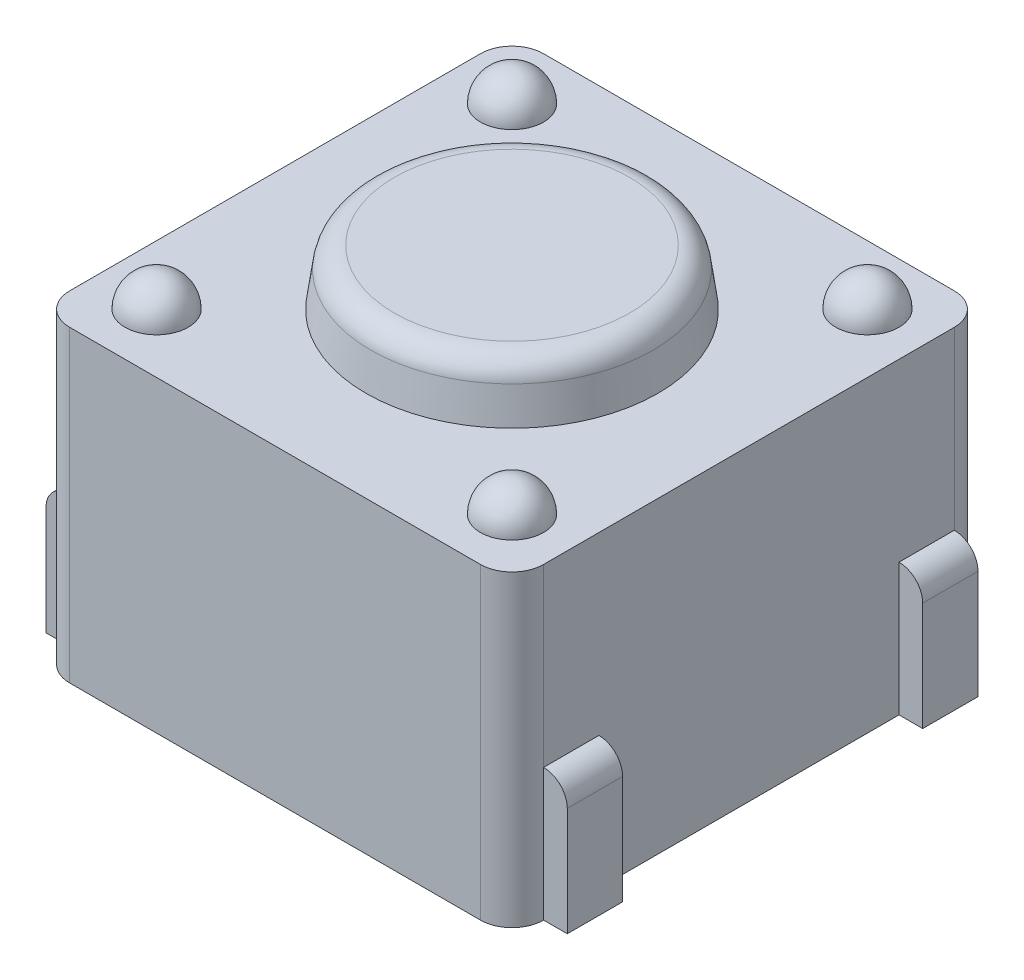
ISO-10303-21;
HEADER;
FILE_DESCRIPTION(('STEP AP214'),'2;1');
FILE_NAME('part.step','',(''),(''),'','','');
FILE_SCHEMA(('AUTOMOTIVE_DESIGN { 1 0 10303 214 1 1 1 1 }'));
ENDSEC;
DATA;
#1=APPLICATION_CONTEXT('core data for automotive mechanical design processes');
#2=APPLICATION_PROTOCOL_DEFINITION('international standard','automotive_design',2000,#1);
#3=PRODUCT_CONTEXT('',#1,'mechanical');
#4=PRODUCT('Part','Part','',(#3));
#5=PRODUCT_RELATED_PRODUCT_CATEGORY('part','',(#4));
#6=PRODUCT_DEFINITION_FORMATION('','',#4);
#7=PRODUCT_DEFINITION_CONTEXT('part definition',#1,'design');
#8=PRODUCT_DEFINITION('design','',#6,#7);
#9=PRODUCT_DEFINITION_SHAPE('','',#8);
#10=(LENGTH_UNIT() NAMED_UNIT(*) SI_UNIT(.MILLI.,.METRE.));
#11=(NAMED_UNIT(*) PLANE_ANGLE_UNIT() SI_UNIT($,.RADIAN.));
#12=(NAMED_UNIT(*) SI_UNIT($,.STERADIAN.) SOLID_ANGLE_UNIT());
#13=UNCERTAINTY_MEASURE_WITH_UNIT(LENGTH_MEASURE(1.E-05),#10,'distance_accuracy_value','');
#14=(GEOMETRIC_REPRESENTATION_CONTEXT(3) GLOBAL_UNCERTAINTY_ASSIGNED_CONTEXT((#13)) GLOBAL_UNIT_ASSIGNED_CONTEXT((#10,
#11,#12)) REPRESENTATION_CONTEXT('',''));
#15=CARTESIAN_POINT('',(0.,0.,0.));
#16=DIRECTION('',(0.,0.,1.));
#17=DIRECTION('',(1.,0.,0.));
#18=AXIS2_PLACEMENT_3D('',#15,#16,#17);
#19=CARTESIAN_POINT('',(-3.00000000000001,3.9,-3.));
#20=DIRECTION('',(0.,-1.,0.));
#21=DIRECTION('',(0.,0.,-1.));
#22=AXIS2_PLACEMENT_3D('',#19,#20,#21);
#23=PLANE('',#22);
#24=CARTESIAN_POINT('',(-2.25,3.9,-2.25));
#25=DIRECTION('',(0.,-1.,0.));
#26=DIRECTION('',(0.,0.,-1.));
#27=AXIS2_PLACEMENT_3D('',#24,#25,#26);
#28=CIRCLE('',#27,0.4);
#29=CARTESIAN_POINT('',(-2.25,3.9,-2.65));
#30=VERTEX_POINT('',#29);
#31=EDGE_CURVE('E239',#30,#30,#28,.F.);
#32=ORIENTED_EDGE('',*,*,#31,.F.);
#33=EDGE_LOOP('',(#32));
#34=FACE_BOUND('',#33,.T.);
#35=CARTESIAN_POINT('',(2.25,3.9,-2.25));
#36=DIRECTION('',(0.,-1.,0.));
#37=DIRECTION('',(0.,0.,-1.));
#38=AXIS2_PLACEMENT_3D('',#35,#36,#37);
#39=CIRCLE('',#38,0.4);
#40=CARTESIAN_POINT('',(2.25,3.9,-2.65));
#41=VERTEX_POINT('',#40);
#42=EDGE_CURVE('E371',#41,#41,#39,.T.);
#43=ORIENTED_EDGE('',*,*,#42,.T.);
#44=EDGE_LOOP('',(#43));
#45=FACE_BOUND('',#44,.T.);
#46=DIRECTION('',(0.,0.,-1.));
#47=VECTOR('',#46,1.);
#48=CARTESIAN_POINT('',(2.99999999999999,3.9,3.00000000000002));
#49=LINE('',#48,#47);
#50=CARTESIAN_POINT('',(2.99999999999999,3.9,2.60000000000002));
#51=VERTEX_POINT('',#50);
#52=CARTESIAN_POINT('',(2.99999999999999,3.9,-2.59999999999999));
#53=VERTEX_POINT('',#52);
#54=EDGE_CURVE('E334',#51,#53,#49,.T.);
#55=ORIENTED_EDGE('',*,*,#54,.T.);
#56=CARTESIAN_POINT('',(2.59999999999999,3.9,-2.59999999999999));
#57=DIRECTION('',(0.,-1.,0.));
#58=DIRECTION('',(0.,0.,-1.));
#59=AXIS2_PLACEMENT_3D('',#56,#57,#58);
#60=CIRCLE('',#59,0.4);
#61=CARTESIAN_POINT('',(2.59999999999999,3.9,-2.99999999999999));
#62=VERTEX_POINT('',#61);
#63=EDGE_CURVE('E271',#53,#62,#60,.F.);
#64=ORIENTED_EDGE('',*,*,#63,.T.);
#65=DIRECTION('',(-1.,0.,0.));
#66=VECTOR('',#65,1.);
#67=CARTESIAN_POINT('',(-3.00000000000001,3.9,-3.));
#68=LINE('',#67,#66);
#69=CARTESIAN_POINT('',(-2.60000000000001,3.9,-3.));
#70=VERTEX_POINT('',#69);
#71=EDGE_CURVE('E351',#62,#70,#68,.T.);
#72=ORIENTED_EDGE('',*,*,#71,.T.);
#73=CARTESIAN_POINT('',(-2.60000000000001,3.9,-2.59999999999999));
#74=DIRECTION('',(0.,-1.,0.));
#75=DIRECTION('',(0.,0.,-1.));
#76=AXIS2_PLACEMENT_3D('',#73,#74,#75);
#77=CIRCLE('',#76,0.4);
#78=CARTESIAN_POINT('',(-3.00000000000001,3.9,-2.59999999999999));
#79=VERTEX_POINT('',#78);
#80=EDGE_CURVE('E269',#70,#79,#77,.F.);
#81=ORIENTED_EDGE('',*,*,#80,.T.);
#82=DIRECTION('',(0.,0.,1.));
#83=VECTOR('',#82,1.);
#84=CARTESIAN_POINT('',(-3.00000000000001,3.9,3.00000000000003));
#85=LINE('',#84,#83);
#86=CARTESIAN_POINT('',(-3.00000000000001,3.9,2.60000000000003));
#87=VERTEX_POINT('',#86);
#88=EDGE_CURVE('E343',#79,#87,#85,.T.);
#89=ORIENTED_EDGE('',*,*,#88,.T.);
#90=CARTESIAN_POINT('',(-2.60000000000001,3.9,2.60000000000003));
#91=DIRECTION('',(0.,-1.,0.));
#92=DIRECTION('',(0.,0.,-1.));
#93=AXIS2_PLACEMENT_3D('',#90,#91,#92);
#94=CIRCLE('',#93,0.4);
#95=CARTESIAN_POINT('',(-2.60000000000001,3.9,3.00000000000003));
#96=VERTEX_POINT('',#95);
#97=EDGE_CURVE('E267',#87,#96,#94,.F.);
#98=ORIENTED_EDGE('',*,*,#97,.T.);
#99=DIRECTION('',(1.,0.,0.));
#100=VECTOR('',#99,1.);
#101=CARTESIAN_POINT('',(-3.00000000000001,3.9,3.00000000000003));
#102=LINE('',#101,#100);
#103=CARTESIAN_POINT('',(2.59999999999999,3.9,3.00000000000002));
#104=VERTEX_POINT('',#103);
#105=EDGE_CURVE('E346',#96,#104,#102,.T.);
#106=ORIENTED_EDGE('',*,*,#105,.T.);
#107=CARTESIAN_POINT('',(2.59999999999999,3.9,2.60000000000002));
#108=DIRECTION('',(0.,-1.,0.));
#109=DIRECTION('',(0.,0.,-1.));
#110=AXIS2_PLACEMENT_3D('',#107,#108,#109);
#111=CIRCLE('',#110,0.4);
#112=EDGE_CURVE('E265',#104,#51,#111,.F.);
#113=ORIENTED_EDGE('',*,*,#112,.T.);
#114=EDGE_LOOP('',(#55,#64,#72,#81,#89,#98,#106,#113));
#115=FACE_BOUND('',#114,.T.);
#116=CARTESIAN_POINT('',(2.25,3.9,2.25));
#117=DIRECTION('',(0.,-1.,0.));
#118=DIRECTION('',(0.,0.,-1.));
#119=AXIS2_PLACEMENT_3D('',#116,#117,#118);
#120=CIRCLE('',#119,0.4);
#121=CARTESIAN_POINT('',(2.25,3.9,1.85));
#122=VERTEX_POINT('',#121);
#123=EDGE_CURVE('E243',#122,#122,#120,.F.);
#124=ORIENTED_EDGE('',*,*,#123,.F.);
#125=EDGE_LOOP('',(#124));
#126=FACE_BOUND('',#125,.T.);
#127=CARTESIAN_POINT('',(-2.25,3.9,2.25));
#128=DIRECTION('',(0.,-1.,0.));
#129=DIRECTION('',(0.,0.,1.));
#130=AXIS2_PLACEMENT_3D('',#127,#128,#129);
#131=CIRCLE('',#130,0.4);
#132=CARTESIAN_POINT('',(-2.25,3.9,2.65));
#133=VERTEX_POINT('',#132);
#134=EDGE_CURVE('E216',#133,#133,#131,.T.);
#135=ORIENTED_EDGE('',*,*,#134,.T.);
#136=EDGE_LOOP('',(#135));
#137=FACE_BOUND('',#136,.T.);
#138=CARTESIAN_POINT('',(0.,3.9,0.));
#139=DIRECTION('',(0.,-1.,0.));
#140=DIRECTION('',(0.,0.,-1.));
#141=AXIS2_PLACEMENT_3D('',#138,#139,#140);
#142=CIRCLE('',#141,1.84837858429167);
#143=CARTESIAN_POINT('',(0.,3.9,-1.84837858429167));
#144=VERTEX_POINT('',#143);
#145=EDGE_CURVE('E283',#144,#144,#142,.F.);
#146=ORIENTED_EDGE('',*,*,#145,.F.);
#147=EDGE_LOOP('',(#146));
#148=FACE_BOUND('',#147,.T.);
#149=ADVANCED_FACE('F32',(#34,#45,#115,#126,#137,#148),#23,.F.);
#150=CARTESIAN_POINT('',(-3.00000000000001,3.9,3.00000000000003));
#151=DIRECTION('',(1.,0.,0.));
#152=DIRECTION('',(0.,0.,-1.));
#153=AXIS2_PLACEMENT_3D('',#150,#151,#152);
#154=PLANE('',#153);
#155=ORIENTED_EDGE('',*,*,#88,.F.);
#156=DIRECTION('',(0.,-1.,0.));
#157=VECTOR('',#156,1.);
#158=CARTESIAN_POINT('',(-3.00000000000001,3.9,-2.59999999999999));
#159=LINE('',#158,#157);
#160=CARTESIAN_POINT('',(-2.99999999999999,1.67489698097078,-2.6));
#161=VERTEX_POINT('',#160);
#162=EDGE_CURVE('E275',#79,#161,#159,.T.);
#163=ORIENTED_EDGE('',*,*,#162,.T.);
#164=DIRECTION('',(0.,0.,-1.));
#165=VECTOR('',#164,1.);
#166=CARTESIAN_POINT('',(-2.99999999999999,1.67489698097078,-2.6));
#167=LINE('',#166,#165);
#168=CARTESIAN_POINT('',(-2.99999999999999,1.67489698097079,-1.9));
#169=VERTEX_POINT('',#168);
#170=EDGE_CURVE('E223',#169,#161,#167,.T.);
#171=ORIENTED_EDGE('',*,*,#170,.F.);
#172=DIRECTION('',(0.,1.,0.));
#173=VECTOR('',#172,1.);
#174=CARTESIAN_POINT('',(-2.99999999999999,0.,-1.9));
#175=LINE('',#174,#173);
#176=CARTESIAN_POINT('',(-3.00000000000001,0.,-1.9));
#177=VERTEX_POINT('',#176);
#178=EDGE_CURVE('E236',#177,#169,#175,.T.);
#179=ORIENTED_EDGE('',*,*,#178,.F.);
#180=DIRECTION('',(0.,0.,1.));
#181=VECTOR('',#180,1.);
#182=CARTESIAN_POINT('',(-3.00000000000001,0.,3.00000000000003));
#183=LINE('',#182,#181);
#184=CARTESIAN_POINT('',(-3.00000000000001,0.,1.9));
#185=VERTEX_POINT('',#184);
#186=EDGE_CURVE('E359',#177,#185,#183,.T.);
#187=ORIENTED_EDGE('',*,*,#186,.T.);
#188=DIRECTION('',(0.,1.,0.));
#189=VECTOR('',#188,1.);
#190=CARTESIAN_POINT('',(-2.99999999999999,0.,1.9));
#191=LINE('',#190,#189);
#192=CARTESIAN_POINT('',(-3.00000000000001,1.67489698097078,1.9));
#193=VERTEX_POINT('',#192);
#194=EDGE_CURVE('E188',#185,#193,#191,.T.);
#195=ORIENTED_EDGE('',*,*,#194,.T.);
#196=DIRECTION('',(0.,0.,1.));
#197=VECTOR('',#196,1.);
#198=CARTESIAN_POINT('',(-2.99999999999999,1.67489698097078,2.6));
#199=LINE('',#198,#197);
#200=CARTESIAN_POINT('',(-3.00000000000001,1.67489698097079,2.6));
#201=VERTEX_POINT('',#200);
#202=EDGE_CURVE('E215',#193,#201,#199,.T.);
#203=ORIENTED_EDGE('',*,*,#202,.T.);
#204=DIRECTION('',(0.,-1.,0.));
#205=VECTOR('',#204,1.);
#206=CARTESIAN_POINT('',(-3.00000000000001,3.9,2.60000000000003));
#207=LINE('',#206,#205);
#208=EDGE_CURVE('E273',#201,#87,#207,.F.);
#209=ORIENTED_EDGE('',*,*,#208,.T.);
#210=EDGE_LOOP('',(#155,#163,#171,#179,#187,#195,#203,#209));
#211=FACE_BOUND('',#210,.T.);
#212=ADVANCED_FACE('F433',(#211),#154,.F.);
#213=CARTESIAN_POINT('',(2.99999999999999,3.9,3.00000000000002));
#214=DIRECTION('',(-1.,0.,0.));
#215=DIRECTION('',(0.,0.,1.));
#216=AXIS2_PLACEMENT_3D('',#213,#214,#215);
#217=PLANE('',#216);
#218=DIRECTION('',(0.,0.,-1.));
#219=VECTOR('',#218,1.);
#220=CARTESIAN_POINT('',(2.99999999999999,1.67489698097078,-2.6));
#221=LINE('',#220,#219);
#222=CARTESIAN_POINT('',(2.99999999999999,1.67489698097078,-1.9));
#223=VERTEX_POINT('',#222);
#224=CARTESIAN_POINT('',(2.99999999999999,1.67489698097078,-2.6));
#225=VERTEX_POINT('',#224);
#226=EDGE_CURVE('E379',#223,#225,#221,.T.);
#227=ORIENTED_EDGE('',*,*,#226,.T.);
#228=DIRECTION('',(0.,-1.,0.));
#229=VECTOR('',#228,1.);
#230=CARTESIAN_POINT('',(2.99999999999999,3.9,-2.59999999999999));
#231=LINE('',#230,#229);
#232=EDGE_CURVE('E263',#225,#53,#231,.F.);
#233=ORIENTED_EDGE('',*,*,#232,.T.);
#234=ORIENTED_EDGE('',*,*,#54,.F.);
#235=DIRECTION('',(0.,-1.,0.));
#236=VECTOR('',#235,1.);
#237=CARTESIAN_POINT('',(2.99999999999999,3.9,2.60000000000002));
#238=LINE('',#237,#236);
#239=CARTESIAN_POINT('',(2.99999999999999,1.67489698097078,2.6));
#240=VERTEX_POINT('',#239);
#241=EDGE_CURVE('E260',#51,#240,#238,.T.);
#242=ORIENTED_EDGE('',*,*,#241,.T.);
#243=DIRECTION('',(0.,0.,1.));
#244=VECTOR('',#243,1.);
#245=CARTESIAN_POINT('',(2.99999999999999,1.67489698097078,2.6));
#246=LINE('',#245,#244);
#247=CARTESIAN_POINT('',(2.99999999999999,1.67489698097079,1.9));
#248=VERTEX_POINT('',#247);
#249=EDGE_CURVE('E332',#248,#240,#246,.T.);
#250=ORIENTED_EDGE('',*,*,#249,.F.);
#251=DIRECTION('',(0.,1.,0.));
#252=VECTOR('',#251,1.);
#253=CARTESIAN_POINT('',(2.99999999999999,0.,1.9));
#254=LINE('',#253,#252);
#255=CARTESIAN_POINT('',(2.99999999999999,0.,1.9));
#256=VERTEX_POINT('',#255);
#257=EDGE_CURVE('E325',#256,#248,#254,.T.);
#258=ORIENTED_EDGE('',*,*,#257,.F.);
#259=DIRECTION('',(0.,0.,-1.));
#260=VECTOR('',#259,1.);
#261=CARTESIAN_POINT('',(2.99999999999999,0.,3.00000000000002));
#262=LINE('',#261,#260);
#263=CARTESIAN_POINT('',(2.99999999999999,0.,-1.9));
#264=VERTEX_POINT('',#263);
#265=EDGE_CURVE('E413',#256,#264,#262,.T.);
#266=ORIENTED_EDGE('',*,*,#265,.T.);
#267=DIRECTION('',(0.,1.,0.));
#268=VECTOR('',#267,1.);
#269=CARTESIAN_POINT('',(2.99999999999999,0.,-1.9));
#270=LINE('',#269,#268);
#271=EDGE_CURVE('E385',#264,#223,#270,.T.);
#272=ORIENTED_EDGE('',*,*,#271,.T.);
#273=EDGE_LOOP('',(#227,#233,#234,#242,#250,#258,#266,#272));
#274=FACE_BOUND('',#273,.T.);
#275=ADVANCED_FACE('F331',(#274),#217,.F.);
#276=CARTESIAN_POINT('',(-3.00000000000001,3.9,3.00000000000003));
#277=DIRECTION('',(0.,0.,-1.));
#278=DIRECTION('',(-1.,0.,0.));
#279=AXIS2_PLACEMENT_3D('',#276,#277,#278);
#280=PLANE('',#279);
#281=ORIENTED_EDGE('',*,*,#105,.F.);
#282=DIRECTION('',(0.,-1.,0.));
#283=VECTOR('',#282,1.);
#284=CARTESIAN_POINT('',(-2.60000000000001,3.9,3.00000000000003));
#285=LINE('',#284,#283);
#286=CARTESIAN_POINT('',(-2.60000000000001,0.,3.00000000000003));
#287=VERTEX_POINT('',#286);
#288=EDGE_CURVE('E280',#96,#287,#285,.T.);
#289=ORIENTED_EDGE('',*,*,#288,.T.);
#290=DIRECTION('',(1.,0.,0.));
#291=VECTOR('',#290,1.);
#292=CARTESIAN_POINT('',(-3.00000000000001,0.,3.00000000000003));
#293=LINE('',#292,#291);
#294=CARTESIAN_POINT('',(2.59999999999999,0.,3.00000000000002));
#295=VERTEX_POINT('',#294);
#296=EDGE_CURVE('E356',#287,#295,#293,.T.);
#297=ORIENTED_EDGE('',*,*,#296,.T.);
#298=DIRECTION('',(0.,-1.,0.));
#299=VECTOR('',#298,1.);
#300=CARTESIAN_POINT('',(2.59999999999999,3.9,3.00000000000002));
#301=LINE('',#300,#299);
#302=EDGE_CURVE('E278',#295,#104,#301,.F.);
#303=ORIENTED_EDGE('',*,*,#302,.T.);
#304=EDGE_LOOP('',(#281,#289,#297,#303));
#305=FACE_BOUND('',#304,.T.);
#306=ADVANCED_FACE('F443',(#305),#280,.F.);
#307=CARTESIAN_POINT('',(-3.00000000000001,3.9,-3.));
#308=DIRECTION('',(0.,0.,1.));
#309=DIRECTION('',(1.,0.,0.));
#310=AXIS2_PLACEMENT_3D('',#307,#308,#309);
#311=PLANE('',#310);
#312=ORIENTED_EDGE('',*,*,#71,.F.);
#313=DIRECTION('',(0.,-1.,0.));
#314=VECTOR('',#313,1.);
#315=CARTESIAN_POINT('',(2.59999999999999,3.9,-2.99999999999999));
#316=LINE('',#315,#314);
#317=CARTESIAN_POINT('',(2.59999999999999,0.,-2.99999999999999));
#318=VERTEX_POINT('',#317);
#319=EDGE_CURVE('E245',#62,#318,#316,.T.);
#320=ORIENTED_EDGE('',*,*,#319,.T.);
#321=DIRECTION('',(-1.,0.,0.));
#322=VECTOR('',#321,1.);
#323=CARTESIAN_POINT('',(-3.00000000000001,0.,-3.));
#324=LINE('',#323,#322);
#325=CARTESIAN_POINT('',(-2.60000000000001,0.,-3.));
#326=VERTEX_POINT('',#325);
#327=EDGE_CURVE('E347',#318,#326,#324,.T.);
#328=ORIENTED_EDGE('',*,*,#327,.T.);
#329=DIRECTION('',(0.,-1.,0.));
#330=VECTOR('',#329,1.);
#331=CARTESIAN_POINT('',(-2.60000000000001,3.9,-3.));
#332=LINE('',#331,#330);
#333=EDGE_CURVE('E242',#326,#70,#332,.F.);
#334=ORIENTED_EDGE('',*,*,#333,.T.);
#335=EDGE_LOOP('',(#312,#320,#328,#334));
#336=FACE_BOUND('',#335,.T.);
#337=ADVANCED_FACE('F420',(#336),#311,.F.);
#338=CARTESIAN_POINT('',(-3.00000000000001,0.,-3.));
#339=DIRECTION('',(0.,-1.,0.));
#340=DIRECTION('',(0.,0.,-1.));
#341=AXIS2_PLACEMENT_3D('',#338,#339,#340);
#342=PLANE('',#341);
#343=ORIENTED_EDGE('',*,*,#327,.F.);
#344=CARTESIAN_POINT('',(2.59999999999999,0.,-2.59999999999999));
#345=DIRECTION('',(0.,-1.,0.));
#346=DIRECTION('',(0.,0.,-1.));
#347=AXIS2_PLACEMENT_3D('',#344,#345,#346);
#348=CIRCLE('',#347,0.4);
#349=CARTESIAN_POINT('',(2.99999999999999,0.,-2.6));
#350=VERTEX_POINT('',#349);
#351=EDGE_CURVE('E256',#318,#350,#348,.T.);
#352=ORIENTED_EDGE('',*,*,#351,.T.);
#353=DIRECTION('',(-1.,0.,0.));
#354=VECTOR('',#353,1.);
#355=CARTESIAN_POINT('',(3.29999999999999,0.,-2.6));
#356=LINE('',#355,#354);
#357=CARTESIAN_POINT('',(3.29999999999999,0.,-2.6));
#358=VERTEX_POINT('',#357);
#359=EDGE_CURVE('E390',#358,#350,#356,.T.);
#360=ORIENTED_EDGE('',*,*,#359,.F.);
#361=DIRECTION('',(0.,0.,1.));
#362=VECTOR('',#361,1.);
#363=CARTESIAN_POINT('',(3.29999999999999,0.,-2.6));
#364=LINE('',#363,#362);
#365=CARTESIAN_POINT('',(3.29999999999999,0.,-1.9));
#366=VERTEX_POINT('',#365);
#367=EDGE_CURVE('E388',#358,#366,#364,.T.);
#368=ORIENTED_EDGE('',*,*,#367,.T.);
#369=DIRECTION('',(-1.,0.,0.));
#370=VECTOR('',#369,1.);
#371=CARTESIAN_POINT('',(3.29999999999999,0.,-1.9));
#372=LINE('',#371,#370);
#373=EDGE_CURVE('E326',#366,#264,#372,.T.);
#374=ORIENTED_EDGE('',*,*,#373,.T.);
#375=ORIENTED_EDGE('',*,*,#265,.F.);
#376=DIRECTION('',(-1.,0.,0.));
#377=VECTOR('',#376,1.);
#378=CARTESIAN_POINT('',(3.29999999999999,0.,1.9));
#379=LINE('',#378,#377);
#380=CARTESIAN_POINT('',(3.29999999999999,0.,1.9));
#381=VERTEX_POINT('',#380);
#382=EDGE_CURVE('E400',#381,#256,#379,.T.);
#383=ORIENTED_EDGE('',*,*,#382,.F.);
#384=DIRECTION('',(0.,0.,-1.));
#385=VECTOR('',#384,1.);
#386=CARTESIAN_POINT('',(3.29999999999999,0.,2.6));
#387=LINE('',#386,#385);
#388=CARTESIAN_POINT('',(3.29999999999999,0.,2.6));
#389=VERTEX_POINT('',#388);
#390=EDGE_CURVE('E336',#389,#381,#387,.T.);
#391=ORIENTED_EDGE('',*,*,#390,.F.);
#392=DIRECTION('',(-1.,0.,0.));
#393=VECTOR('',#392,1.);
#394=CARTESIAN_POINT('',(3.29999999999999,0.,2.6));
#395=LINE('',#394,#393);
#396=CARTESIAN_POINT('',(2.99999999999999,0.,2.6));
#397=VERTEX_POINT('',#396);
#398=EDGE_CURVE('E362',#389,#397,#395,.T.);
#399=ORIENTED_EDGE('',*,*,#398,.T.);
#400=CARTESIAN_POINT('',(2.59999999999999,0.,2.60000000000002));
#401=DIRECTION('',(0.,-1.,0.));
#402=DIRECTION('',(0.,0.,-1.));
#403=AXIS2_PLACEMENT_3D('',#400,#401,#402);
#404=CIRCLE('',#403,0.4);
#405=EDGE_CURVE('E248',#397,#295,#404,.T.);
#406=ORIENTED_EDGE('',*,*,#405,.T.);
#407=ORIENTED_EDGE('',*,*,#296,.F.);
#408=CARTESIAN_POINT('',(-2.60000000000001,0.,2.60000000000003));
#409=DIRECTION('',(0.,-1.,0.));
#410=DIRECTION('',(0.,0.,-1.));
#411=AXIS2_PLACEMENT_3D('',#408,#409,#410);
#412=CIRCLE('',#411,0.4);
#413=CARTESIAN_POINT('',(-2.99999999999999,0.,2.6));
#414=VERTEX_POINT('',#413);
#415=EDGE_CURVE('E250',#287,#414,#412,.T.);
#416=ORIENTED_EDGE('',*,*,#415,.T.);
#417=DIRECTION('',(1.,0.,0.));
#418=VECTOR('',#417,1.);
#419=CARTESIAN_POINT('',(-3.29999999999999,0.,2.6));
#420=LINE('',#419,#418);
#421=CARTESIAN_POINT('',(-3.29999999999999,0.,2.6));
#422=VERTEX_POINT('',#421);
#423=EDGE_CURVE('E193',#422,#414,#420,.T.);
#424=ORIENTED_EDGE('',*,*,#423,.F.);
#425=DIRECTION('',(0.,0.,-1.));
#426=VECTOR('',#425,1.);
#427=CARTESIAN_POINT('',(-3.29999999999999,0.,2.6));
#428=LINE('',#427,#426);
#429=CARTESIAN_POINT('',(-3.29999999999999,0.,1.9));
#430=VERTEX_POINT('',#429);
#431=EDGE_CURVE('E199',#422,#430,#428,.T.);
#432=ORIENTED_EDGE('',*,*,#431,.T.);
#433=DIRECTION('',(1.,0.,0.));
#434=VECTOR('',#433,1.);
#435=CARTESIAN_POINT('',(-3.29999999999999,0.,1.9));
#436=LINE('',#435,#434);
#437=EDGE_CURVE('E182',#430,#185,#436,.T.);
#438=ORIENTED_EDGE('',*,*,#437,.T.);
#439=ORIENTED_EDGE('',*,*,#186,.F.);
#440=DIRECTION('',(1.,0.,0.));
#441=VECTOR('',#440,1.);
#442=CARTESIAN_POINT('',(-3.29999999999999,0.,-1.9));
#443=LINE('',#442,#441);
#444=CARTESIAN_POINT('',(-3.29999999999999,0.,-1.9));
#445=VERTEX_POINT('',#444);
#446=EDGE_CURVE('E228',#445,#177,#443,.T.);
#447=ORIENTED_EDGE('',*,*,#446,.F.);
#448=DIRECTION('',(0.,0.,1.));
#449=VECTOR('',#448,1.);
#450=CARTESIAN_POINT('',(-3.29999999999999,0.,-2.6));
#451=LINE('',#450,#449);
#452=CARTESIAN_POINT('',(-3.29999999999999,0.,-2.6));
#453=VERTEX_POINT('',#452);
#454=EDGE_CURVE('E222',#453,#445,#451,.T.);
#455=ORIENTED_EDGE('',*,*,#454,.F.);
#456=DIRECTION('',(1.,0.,0.));
#457=VECTOR('',#456,1.);
#458=CARTESIAN_POINT('',(-3.29999999999999,0.,-2.6));
#459=LINE('',#458,#457);
#460=CARTESIAN_POINT('',(-3.00000000000001,0.,-2.6));
#461=VERTEX_POINT('',#460);
#462=EDGE_CURVE('E369',#453,#461,#459,.T.);
#463=ORIENTED_EDGE('',*,*,#462,.T.);
#464=CARTESIAN_POINT('',(-2.60000000000001,0.,-2.59999999999999));
#465=DIRECTION('',(0.,-1.,0.));
#466=DIRECTION('',(0.,0.,-1.));
#467=AXIS2_PLACEMENT_3D('',#464,#465,#466);
#468=CIRCLE('',#467,0.4);
#469=EDGE_CURVE('E254',#461,#326,#468,.T.);
#470=ORIENTED_EDGE('',*,*,#469,.T.);
#471=EDGE_LOOP('',(#343,#352,#360,#368,#374,#375,#383,#391,#399,#406,#407,#416,#424,#432,#438,
#439,#447,#455,#463,#470));
#472=FACE_BOUND('',#471,.T.);
#473=ADVANCED_FACE('F206',(#472),#342,.T.);
#474=CARTESIAN_POINT('',(3.29999999999999,0.,2.6));
#475=DIRECTION('',(0.,0.,-1.));
#476=DIRECTION('',(0.,1.,0.));
#477=AXIS2_PLACEMENT_3D('',#474,#475,#476);
#478=PLANE('',#477);
#479=DIRECTION('',(0.,-1.,0.));
#480=VECTOR('',#479,1.);
#481=CARTESIAN_POINT('',(3.29999999999999,0.,2.6));
#482=LINE('',#481,#480);
#483=CARTESIAN_POINT('',(3.29999999999999,1.37489698097079,2.6));
#484=VERTEX_POINT('',#483);
#485=EDGE_CURVE('E319',#484,#389,#482,.T.);
#486=ORIENTED_EDGE('',*,*,#485,.F.);
#487=CARTESIAN_POINT('',(2.99999999999999,1.37489698097079,2.6));
#488=DIRECTION('',(0.,0.,-1.));
#489=DIRECTION('',(0.,1.,0.));
#490=AXIS2_PLACEMENT_3D('',#487,#488,#489);
#491=CIRCLE('',#490,0.3);
#492=EDGE_CURVE('E40',#484,#240,#491,.F.);
#493=ORIENTED_EDGE('',*,*,#492,.T.);
#494=DIRECTION('',(0.,-1.,0.));
#495=VECTOR('',#494,1.);
#496=CARTESIAN_POINT('',(2.99999999999999,0.,2.6));
#497=LINE('',#496,#495);
#498=EDGE_CURVE('E317',#240,#397,#497,.T.);
#499=ORIENTED_EDGE('',*,*,#498,.T.);
#500=ORIENTED_EDGE('',*,*,#398,.F.);
#501=EDGE_LOOP('',(#486,#493,#499,#500));
#502=FACE_BOUND('',#501,.T.);
#503=ADVANCED_FACE('F315',(#502),#478,.F.);
#504=CARTESIAN_POINT('',(3.29999999999999,0.,1.9));
#505=DIRECTION('',(0.,0.,1.));
#506=DIRECTION('',(0.,-1.,0.));
#507=AXIS2_PLACEMENT_3D('',#504,#505,#506);
#508=PLANE('',#507);
#509=ORIENTED_EDGE('',*,*,#257,.T.);
#510=CARTESIAN_POINT('',(2.99999999999999,1.37489698097079,1.9));
#511=DIRECTION('',(0.,0.,1.));
#512=DIRECTION('',(0.,-1.,0.));
#513=AXIS2_PLACEMENT_3D('',#510,#511,#512);
#514=CIRCLE('',#513,0.3);
#515=CARTESIAN_POINT('',(3.29999999999999,1.37489698097079,1.9));
#516=VERTEX_POINT('',#515);
#517=EDGE_CURVE('E11',#248,#516,#514,.F.);
#518=ORIENTED_EDGE('',*,*,#517,.T.);
#519=DIRECTION('',(0.,1.,0.));
#520=VECTOR('',#519,1.);
#521=CARTESIAN_POINT('',(3.29999999999999,0.,1.9));
#522=LINE('',#521,#520);
#523=EDGE_CURVE('E399',#381,#516,#522,.T.);
#524=ORIENTED_EDGE('',*,*,#523,.F.);
#525=ORIENTED_EDGE('',*,*,#382,.T.);
#526=EDGE_LOOP('',(#509,#518,#524,#525));
#527=FACE_BOUND('',#526,.T.);
#528=ADVANCED_FACE('F469',(#527),#508,.F.);
#529=CARTESIAN_POINT('',(3.29999999999999,1.67489698097078,2.6));
#530=DIRECTION('',(-1.,0.,0.));
#531=DIRECTION('',(0.,0.,1.));
#532=AXIS2_PLACEMENT_3D('',#529,#530,#531);
#533=PLANE('',#532);
#534=ORIENTED_EDGE('',*,*,#523,.T.);
#535=DIRECTION('',(0.,0.,1.));
#536=VECTOR('',#535,1.);
#537=CARTESIAN_POINT('',(3.29999999999999,1.37489698097079,2.6));
#538=LINE('',#537,#536);
#539=EDGE_CURVE('E310',#516,#484,#538,.T.);
#540=ORIENTED_EDGE('',*,*,#539,.T.);
#541=ORIENTED_EDGE('',*,*,#485,.T.);
#542=ORIENTED_EDGE('',*,*,#390,.T.);
#543=EDGE_LOOP('',(#534,#540,#541,#542));
#544=FACE_BOUND('',#543,.T.);
#545=ADVANCED_FACE('F471',(#544),#533,.F.);
#546=CARTESIAN_POINT('',(3.29999999999999,0.,-2.6));
#547=DIRECTION('',(0.,0.,-1.));
#548=DIRECTION('',(0.,1.,0.));
#549=AXIS2_PLACEMENT_3D('',#546,#547,#548);
#550=PLANE('',#549);
#551=DIRECTION('',(0.,-1.,0.));
#552=VECTOR('',#551,1.);
#553=CARTESIAN_POINT('',(2.99999999999999,0.,-2.6));
#554=LINE('',#553,#552);
#555=EDGE_CURVE('E375',#225,#350,#554,.T.);
#556=ORIENTED_EDGE('',*,*,#555,.F.);
#557=CARTESIAN_POINT('',(2.99999999999999,1.37489698097079,-2.6));
#558=DIRECTION('',(0.,0.,-1.));
#559=DIRECTION('',(0.,1.,0.));
#560=AXIS2_PLACEMENT_3D('',#557,#558,#559);
#561=CIRCLE('',#560,0.3);
#562=CARTESIAN_POINT('',(3.29999999999999,1.37489698097079,-2.6));
#563=VERTEX_POINT('',#562);
#564=EDGE_CURVE('E304',#225,#563,#561,.T.);
#565=ORIENTED_EDGE('',*,*,#564,.T.);
#566=DIRECTION('',(0.,-1.,0.));
#567=VECTOR('',#566,1.);
#568=CARTESIAN_POINT('',(3.29999999999999,0.,-2.6));
#569=LINE('',#568,#567);
#570=EDGE_CURVE('E382',#563,#358,#569,.T.);
#571=ORIENTED_EDGE('',*,*,#570,.T.);
#572=ORIENTED_EDGE('',*,*,#359,.T.);
#573=EDGE_LOOP('',(#556,#565,#571,#572));
#574=FACE_BOUND('',#573,.T.);
#575=ADVANCED_FACE('F454',(#574),#550,.T.);
#576=CARTESIAN_POINT('',(3.29999999999999,0.,-1.9));
#577=DIRECTION('',(0.,0.,1.));
#578=DIRECTION('',(0.,-1.,0.));
#579=AXIS2_PLACEMENT_3D('',#576,#577,#578);
#580=PLANE('',#579);
#581=DIRECTION('',(0.,1.,0.));
#582=VECTOR('',#581,1.);
#583=CARTESIAN_POINT('',(3.29999999999999,0.,-1.9));
#584=LINE('',#583,#582);
#585=CARTESIAN_POINT('',(3.29999999999999,1.37489698097079,-1.9));
#586=VERTEX_POINT('',#585);
#587=EDGE_CURVE('E384',#366,#586,#584,.T.);
#588=ORIENTED_EDGE('',*,*,#587,.T.);
#589=CARTESIAN_POINT('',(2.99999999999999,1.37489698097079,-1.9));
#590=DIRECTION('',(0.,0.,1.));
#591=DIRECTION('',(0.,-1.,0.));
#592=AXIS2_PLACEMENT_3D('',#589,#590,#591);
#593=CIRCLE('',#592,0.3);
#594=EDGE_CURVE('E308',#586,#223,#593,.T.);
#595=ORIENTED_EDGE('',*,*,#594,.T.);
#596=ORIENTED_EDGE('',*,*,#271,.F.);
#597=ORIENTED_EDGE('',*,*,#373,.F.);
#598=EDGE_LOOP('',(#588,#595,#596,#597));
#599=FACE_BOUND('',#598,.T.);
#600=ADVANCED_FACE('F466',(#599),#580,.T.);
#601=CARTESIAN_POINT('',(3.29999999999999,1.67489698097078,-2.6));
#602=DIRECTION('',(-1.,0.,0.));
#603=DIRECTION('',(0.,0.,-1.));
#604=AXIS2_PLACEMENT_3D('',#601,#602,#603);
#605=PLANE('',#604);
#606=ORIENTED_EDGE('',*,*,#570,.F.);
#607=DIRECTION('',(0.,0.,-1.));
#608=VECTOR('',#607,1.);
#609=CARTESIAN_POINT('',(3.29999999999999,1.37489698097079,-1.9));
#610=LINE('',#609,#608);
#611=EDGE_CURVE('E306',#563,#586,#610,.F.);
#612=ORIENTED_EDGE('',*,*,#611,.T.);
#613=ORIENTED_EDGE('',*,*,#587,.F.);
#614=ORIENTED_EDGE('',*,*,#367,.F.);
#615=EDGE_LOOP('',(#606,#612,#613,#614));
#616=FACE_BOUND('',#615,.T.);
#617=ADVANCED_FACE('F458',(#616),#605,.F.);
#618=CARTESIAN_POINT('',(-3.29999999999999,0.,-2.6));
#619=DIRECTION('',(0.,0.,1.));
#620=DIRECTION('',(0.,-1.,0.));
#621=AXIS2_PLACEMENT_3D('',#618,#619,#620);
#622=PLANE('',#621);
#623=DIRECTION('',(0.,-1.,0.));
#624=VECTOR('',#623,1.);
#625=CARTESIAN_POINT('',(-3.29999999999999,0.,-2.6));
#626=LINE('',#625,#624);
#627=CARTESIAN_POINT('',(-3.29999999999999,1.37489698097079,-2.6));
#628=VERTEX_POINT('',#627);
#629=EDGE_CURVE('E220',#628,#453,#626,.T.);
#630=ORIENTED_EDGE('',*,*,#629,.F.);
#631=CARTESIAN_POINT('',(-2.99999999999999,1.37489698097079,-2.6));
#632=DIRECTION('',(0.,0.,1.));
#633=DIRECTION('',(0.,-1.,0.));
#634=AXIS2_PLACEMENT_3D('',#631,#632,#633);
#635=CIRCLE('',#634,0.3);
#636=EDGE_CURVE('E295',#628,#161,#635,.F.);
#637=ORIENTED_EDGE('',*,*,#636,.T.);
#638=DIRECTION('',(0.,-1.,0.));
#639=VECTOR('',#638,1.);
#640=CARTESIAN_POINT('',(-2.99999999999999,0.,-2.6));
#641=LINE('',#640,#639);
#642=EDGE_CURVE('E192',#161,#461,#641,.T.);
#643=ORIENTED_EDGE('',*,*,#642,.T.);
#644=ORIENTED_EDGE('',*,*,#462,.F.);
#645=EDGE_LOOP('',(#630,#637,#643,#644));
#646=FACE_BOUND('',#645,.T.);
#647=ADVANCED_FACE('F633',(#646),#622,.F.);
#648=CARTESIAN_POINT('',(-3.29999999999999,0.,-1.9));
#649=DIRECTION('',(0.,0.,-1.));
#650=DIRECTION('',(0.,1.,0.));
#651=AXIS2_PLACEMENT_3D('',#648,#649,#650);
#652=PLANE('',#651);
#653=ORIENTED_EDGE('',*,*,#178,.T.);
#654=CARTESIAN_POINT('',(-2.99999999999999,1.37489698097079,-1.9));
#655=DIRECTION('',(0.,0.,-1.));
#656=DIRECTION('',(0.,1.,0.));
#657=AXIS2_PLACEMENT_3D('',#654,#655,#656);
#658=CIRCLE('',#657,0.3);
#659=CARTESIAN_POINT('',(-3.29999999999999,1.37489698097079,-1.9));
#660=VERTEX_POINT('',#659);
#661=EDGE_CURVE('E297',#169,#660,#658,.F.);
#662=ORIENTED_EDGE('',*,*,#661,.T.);
#663=DIRECTION('',(0.,1.,0.));
#664=VECTOR('',#663,1.);
#665=CARTESIAN_POINT('',(-3.29999999999999,0.,-1.9));
#666=LINE('',#665,#664);
#667=EDGE_CURVE('E225',#445,#660,#666,.T.);
#668=ORIENTED_EDGE('',*,*,#667,.F.);
#669=ORIENTED_EDGE('',*,*,#446,.T.);
#670=EDGE_LOOP('',(#653,#662,#668,#669));
#671=FACE_BOUND('',#670,.T.);
#672=ADVANCED_FACE('F623',(#671),#652,.F.);
#673=CARTESIAN_POINT('',(-3.29999999999999,1.67489698097078,-2.6));
#674=DIRECTION('',(1.,0.,0.));
#675=DIRECTION('',(0.,0.,-1.));
#676=AXIS2_PLACEMENT_3D('',#673,#674,#675);
#677=PLANE('',#676);
#678=ORIENTED_EDGE('',*,*,#667,.T.);
#679=DIRECTION('',(0.,0.,-1.));
#680=VECTOR('',#679,1.);
#681=CARTESIAN_POINT('',(-3.29999999999999,1.37489698097079,-2.6));
#682=LINE('',#681,#680);
#683=EDGE_CURVE('E292',#660,#628,#682,.T.);
#684=ORIENTED_EDGE('',*,*,#683,.T.);
#685=ORIENTED_EDGE('',*,*,#629,.T.);
#686=ORIENTED_EDGE('',*,*,#454,.T.);
#687=EDGE_LOOP('',(#678,#684,#685,#686));
#688=FACE_BOUND('',#687,.T.);
#689=ADVANCED_FACE('F612',(#688),#677,.F.);
#690=CARTESIAN_POINT('',(-3.29999999999999,0.,2.6));
#691=DIRECTION('',(0.,0.,1.));
#692=DIRECTION('',(0.,-1.,0.));
#693=AXIS2_PLACEMENT_3D('',#690,#691,#692);
#694=PLANE('',#693);
#695=DIRECTION('',(0.,-1.,0.));
#696=VECTOR('',#695,1.);
#697=CARTESIAN_POINT('',(-2.99999999999999,0.,2.6));
#698=LINE('',#697,#696);
#699=EDGE_CURVE('E212',#201,#414,#698,.T.);
#700=ORIENTED_EDGE('',*,*,#699,.F.);
#701=CARTESIAN_POINT('',(-2.99999999999999,1.37489698097079,2.6));
#702=DIRECTION('',(0.,0.,1.));
#703=DIRECTION('',(0.,-1.,0.));
#704=AXIS2_PLACEMENT_3D('',#701,#702,#703);
#705=CIRCLE('',#704,0.3);
#706=CARTESIAN_POINT('',(-3.29999999999999,1.37489698097079,2.6));
#707=VERTEX_POINT('',#706);
#708=EDGE_CURVE('E299',#201,#707,#705,.T.);
#709=ORIENTED_EDGE('',*,*,#708,.T.);
#710=DIRECTION('',(0.,-1.,0.));
#711=VECTOR('',#710,1.);
#712=CARTESIAN_POINT('',(-3.29999999999999,0.,2.6));
#713=LINE('',#712,#711);
#714=EDGE_CURVE('E202',#707,#422,#713,.T.);
#715=ORIENTED_EDGE('',*,*,#714,.T.);
#716=ORIENTED_EDGE('',*,*,#423,.T.);
#717=EDGE_LOOP('',(#700,#709,#715,#716));
#718=FACE_BOUND('',#717,.T.);
#719=ADVANCED_FACE('F603',(#718),#694,.T.);
#720=CARTESIAN_POINT('',(-3.29999999999999,0.,1.9));
#721=DIRECTION('',(0.,0.,-1.));
#722=DIRECTION('',(0.,1.,0.));
#723=AXIS2_PLACEMENT_3D('',#720,#721,#722);
#724=PLANE('',#723);
#725=DIRECTION('',(0.,1.,0.));
#726=VECTOR('',#725,1.);
#727=CARTESIAN_POINT('',(-3.29999999999999,0.,1.9));
#728=LINE('',#727,#726);
#729=CARTESIAN_POINT('',(-3.29999999999999,1.37489698097079,1.9));
#730=VERTEX_POINT('',#729);
#731=EDGE_CURVE('E185',#430,#730,#728,.T.);
#732=ORIENTED_EDGE('',*,*,#731,.T.);
#733=CARTESIAN_POINT('',(-2.99999999999999,1.37489698097079,1.9));
#734=DIRECTION('',(0.,0.,-1.));
#735=DIRECTION('',(0.,1.,0.));
#736=AXIS2_PLACEMENT_3D('',#733,#734,#735);
#737=CIRCLE('',#736,0.3);
#738=EDGE_CURVE('E302',#730,#193,#737,.T.);
#739=ORIENTED_EDGE('',*,*,#738,.T.);
#740=ORIENTED_EDGE('',*,*,#194,.F.);
#741=ORIENTED_EDGE('',*,*,#437,.F.);
#742=EDGE_LOOP('',(#732,#739,#740,#741));
#743=FACE_BOUND('',#742,.T.);
#744=ADVANCED_FACE('F184',(#743),#724,.T.);
#745=CARTESIAN_POINT('',(-3.29999999999999,1.67489698097078,2.6));
#746=DIRECTION('',(1.,0.,0.));
#747=DIRECTION('',(0.,0.,1.));
#748=AXIS2_PLACEMENT_3D('',#745,#746,#747);
#749=PLANE('',#748);
#750=ORIENTED_EDGE('',*,*,#714,.F.);
#751=DIRECTION('',(0.,0.,1.));
#752=VECTOR('',#751,1.);
#753=CARTESIAN_POINT('',(-3.29999999999999,1.37489698097079,1.9));
#754=LINE('',#753,#752);
#755=EDGE_CURVE('E201',#707,#730,#754,.F.);
#756=ORIENTED_EDGE('',*,*,#755,.T.);
#757=ORIENTED_EDGE('',*,*,#731,.F.);
#758=ORIENTED_EDGE('',*,*,#431,.F.);
#759=EDGE_LOOP('',(#750,#756,#757,#758));
#760=FACE_BOUND('',#759,.T.);
#761=ADVANCED_FACE('F198',(#760),#749,.F.);
#762=CARTESIAN_POINT('',(-2.25,3.9,2.25));
#763=DIRECTION('',(0.,0.,1.));
#764=DIRECTION('',(1.,0.,0.));
#765=AXIS2_PLACEMENT_3D('',#762,#763,#764);
#766=SPHERICAL_SURFACE('',#765,0.4);
#767=CARTESIAN_POINT('',(-2.25,3.9,2.25));
#768=DIRECTION('',(0.,-1.,0.));
#769=DIRECTION('',(0.,0.,1.));
#770=AXIS2_PLACEMENT_3D('',#767,#768,#769);
#771=SPHERICAL_SURFACE('',#770,0.4);
#772=ORIENTED_EDGE('',*,*,#134,.F.);
#773=EDGE_LOOP('',(#772));
#774=FACE_BOUND('',#773,.T.);
#775=ADVANCED_FACE('F496',(#774),#771,.T.);
#776=CARTESIAN_POINT('',(-2.25,3.9,-2.25));
#777=DIRECTION('',(0.,0.,1.));
#778=DIRECTION('',(1.,0.,0.));
#779=AXIS2_PLACEMENT_3D('',#776,#777,#778);
#780=SPHERICAL_SURFACE('',#779,0.4);
#781=CARTESIAN_POINT('',(-2.25,3.9,-2.25));
#782=DIRECTION('',(0.,-1.,0.));
#783=DIRECTION('',(0.,0.,-1.));
#784=AXIS2_PLACEMENT_3D('',#781,#782,#783);
#785=SPHERICAL_SURFACE('',#784,0.4);
#786=ORIENTED_EDGE('',*,*,#31,.T.);
#787=EDGE_LOOP('',(#786));
#788=FACE_BOUND('',#787,.T.);
#789=ADVANCED_FACE('F499',(#788),#785,.T.);
#790=CARTESIAN_POINT('',(2.25,3.9,-2.25));
#791=DIRECTION('',(0.,0.,1.));
#792=DIRECTION('',(1.,0.,0.));
#793=AXIS2_PLACEMENT_3D('',#790,#791,#792);
#794=SPHERICAL_SURFACE('',#793,0.4);
#795=CARTESIAN_POINT('',(2.25,3.9,-2.25));
#796=DIRECTION('',(0.,-1.,0.));
#797=DIRECTION('',(0.,0.,-1.));
#798=AXIS2_PLACEMENT_3D('',#795,#796,#797);
#799=SPHERICAL_SURFACE('',#798,0.4);
#800=ORIENTED_EDGE('',*,*,#42,.F.);
#801=EDGE_LOOP('',(#800));
#802=FACE_BOUND('',#801,.T.);
#803=ADVANCED_FACE('F503',(#802),#799,.T.);
#804=CARTESIAN_POINT('',(2.25,3.9,2.25));
#805=DIRECTION('',(0.,0.,1.));
#806=DIRECTION('',(1.,0.,0.));
#807=AXIS2_PLACEMENT_3D('',#804,#805,#806);
#808=SPHERICAL_SURFACE('',#807,0.4);
#809=CARTESIAN_POINT('',(2.25,3.9,2.25));
#810=DIRECTION('',(0.,-1.,0.));
#811=DIRECTION('',(0.,0.,-1.));
#812=AXIS2_PLACEMENT_3D('',#809,#810,#811);
#813=SPHERICAL_SURFACE('',#812,0.4);
#814=ORIENTED_EDGE('',*,*,#123,.T.);
#815=EDGE_LOOP('',(#814));
#816=FACE_BOUND('',#815,.T.);
#817=ADVANCED_FACE('F507',(#816),#813,.T.);
#818=CARTESIAN_POINT('',(2.59999999999999,3.9,-2.59999999999999));
#819=DIRECTION('',(0.,-1.,0.));
#820=DIRECTION('',(0.,0.,-1.));
#821=AXIS2_PLACEMENT_3D('',#818,#819,#820);
#822=CYLINDRICAL_SURFACE('',#821,0.4);
#823=ORIENTED_EDGE('',*,*,#232,.F.);
#824=ORIENTED_EDGE('',*,*,#555,.T.);
#825=ORIENTED_EDGE('',*,*,#351,.F.);
#826=ORIENTED_EDGE('',*,*,#319,.F.);
#827=ORIENTED_EDGE('',*,*,#63,.F.);
#828=EDGE_LOOP('',(#823,#824,#825,#826,#827));
#829=FACE_BOUND('',#828,.T.);
#830=ADVANCED_FACE('F449',(#829),#822,.T.);
#831=CARTESIAN_POINT('',(-2.60000000000001,3.9,-2.59999999999999));
#832=DIRECTION('',(0.,-1.,0.));
#833=DIRECTION('',(0.,0.,-1.));
#834=AXIS2_PLACEMENT_3D('',#831,#832,#833);
#835=CYLINDRICAL_SURFACE('',#834,0.4);
#836=ORIENTED_EDGE('',*,*,#80,.F.);
#837=ORIENTED_EDGE('',*,*,#333,.F.);
#838=ORIENTED_EDGE('',*,*,#469,.F.);
#839=ORIENTED_EDGE('',*,*,#642,.F.);
#840=ORIENTED_EDGE('',*,*,#162,.F.);
#841=EDGE_LOOP('',(#836,#837,#838,#839,#840));
#842=FACE_BOUND('',#841,.T.);
#843=ADVANCED_FACE('F425',(#842),#835,.T.);
#844=CARTESIAN_POINT('',(-2.60000000000001,3.9,2.60000000000003));
#845=DIRECTION('',(0.,-1.,0.));
#846=DIRECTION('',(0.,0.,-1.));
#847=AXIS2_PLACEMENT_3D('',#844,#845,#846);
#848=CYLINDRICAL_SURFACE('',#847,0.4);
#849=ORIENTED_EDGE('',*,*,#208,.F.);
#850=ORIENTED_EDGE('',*,*,#699,.T.);
#851=ORIENTED_EDGE('',*,*,#415,.F.);
#852=ORIENTED_EDGE('',*,*,#288,.F.);
#853=ORIENTED_EDGE('',*,*,#97,.F.);
#854=EDGE_LOOP('',(#849,#850,#851,#852,#853));
#855=FACE_BOUND('',#854,.T.);
#856=ADVANCED_FACE('F439',(#855),#848,.T.);
#857=CARTESIAN_POINT('',(2.59999999999999,3.9,2.60000000000002));
#858=DIRECTION('',(0.,-1.,0.));
#859=DIRECTION('',(0.,0.,-1.));
#860=AXIS2_PLACEMENT_3D('',#857,#858,#859);
#861=CYLINDRICAL_SURFACE('',#860,0.4);
#862=ORIENTED_EDGE('',*,*,#112,.F.);
#863=ORIENTED_EDGE('',*,*,#302,.F.);
#864=ORIENTED_EDGE('',*,*,#405,.F.);
#865=ORIENTED_EDGE('',*,*,#498,.F.);
#866=ORIENTED_EDGE('',*,*,#241,.F.);
#867=EDGE_LOOP('',(#862,#863,#864,#865,#866));
#868=FACE_BOUND('',#867,.T.);
#869=ADVANCED_FACE('F323',(#868),#861,.T.);
#870=CARTESIAN_POINT('',(0.,4.6,0.));
#871=DIRECTION('',(0.,-1.,0.));
#872=DIRECTION('',(0.,0.,1.));
#873=AXIS2_PLACEMENT_3D('',#870,#871,#872);
#874=CONICAL_SURFACE('',#873,1.75,0.139626340159547);
#875=CARTESIAN_POINT('',(0.,4.34175193028802,0.));
#876=DIRECTION('',(0.,-1.,0.));
#877=DIRECTION('',(0.,0.,-1.));
#878=AXIS2_PLACEMENT_3D('',#875,#876,#877);
#879=CIRCLE('',#878,1.7862943992776);
#880=CARTESIAN_POINT('',(0.,4.34175193028802,-1.7862943992776));
#881=VERTEX_POINT('',#880);
#882=EDGE_CURVE('E289',#881,#881,#879,.T.);
#883=ORIENTED_EDGE('',*,*,#882,.T.);
#884=EDGE_LOOP('',(#883));
#885=FACE_BOUND('',#884,.T.);
#886=ORIENTED_EDGE('',*,*,#145,.T.);
#887=EDGE_LOOP('',(#886));
#888=FACE_BOUND('',#887,.T.);
#889=ADVANCED_FACE('F520',(#885,#888),#874,.T.);
#890=CARTESIAN_POINT('',(0.,4.6,0.));
#891=DIRECTION('',(0.,1.,0.));
#892=DIRECTION('',(0.,0.,1.));
#893=AXIS2_PLACEMENT_3D('',#890,#891,#892);
#894=PLANE('',#893);
#895=CARTESIAN_POINT('',(0.,4.6,0.));
#896=DIRECTION('',(0.,1.,0.));
#897=DIRECTION('',(0.,0.,1.));
#898=AXIS2_PLACEMENT_3D('',#895,#896,#897);
#899=CIRCLE('',#898,1.48921397865513);
#900=CARTESIAN_POINT('',(0.,4.6,1.48921397865513));
#901=VERTEX_POINT('',#900);
#902=EDGE_CURVE('E286',#901,#901,#899,.T.);
#903=ORIENTED_EDGE('',*,*,#902,.T.);
#904=EDGE_LOOP('',(#903));
#905=FACE_BOUND('',#904,.T.);
#906=ADVANCED_FACE('F523',(#905),#894,.T.);
#907=CARTESIAN_POINT('',(0.,4.3,0.));
#908=DIRECTION('',(0.,1.,0.));
#909=DIRECTION('',(0.,0.,1.));
#910=AXIS2_PLACEMENT_3D('',#907,#908,#909);
#911=TOROIDAL_SURFACE('',#910,1.48921397865513,0.3);
#912=ORIENTED_EDGE('',*,*,#882,.F.);
#913=EDGE_LOOP('',(#912));
#914=FACE_BOUND('',#913,.T.);
#915=ORIENTED_EDGE('',*,*,#902,.F.);
#916=EDGE_LOOP('',(#915));
#917=FACE_BOUND('',#916,.T.);
#918=ADVANCED_FACE('F525',(#914,#917),#911,.T.);
#919=CARTESIAN_POINT('',(-2.99999999999999,1.37489698097079,-2.6));
#920=DIRECTION('',(0.,0.,-1.));
#921=DIRECTION('',(0.,1.,0.));
#922=AXIS2_PLACEMENT_3D('',#919,#920,#921);
#923=CYLINDRICAL_SURFACE('',#922,0.3);
#924=ORIENTED_EDGE('',*,*,#661,.F.);
#925=ORIENTED_EDGE('',*,*,#170,.T.);
#926=ORIENTED_EDGE('',*,*,#636,.F.);
#927=ORIENTED_EDGE('',*,*,#683,.F.);
#928=EDGE_LOOP('',(#924,#925,#926,#927));
#929=FACE_BOUND('',#928,.T.);
#930=ADVANCED_FACE('F528',(#929),#923,.T.);
#931=CARTESIAN_POINT('',(-2.99999999999999,1.37489698097079,2.6));
#932=DIRECTION('',(0.,0.,-1.));
#933=DIRECTION('',(0.,1.,0.));
#934=AXIS2_PLACEMENT_3D('',#931,#932,#933);
#935=CYLINDRICAL_SURFACE('',#934,0.3);
#936=ORIENTED_EDGE('',*,*,#738,.F.);
#937=ORIENTED_EDGE('',*,*,#755,.F.);
#938=ORIENTED_EDGE('',*,*,#708,.F.);
#939=ORIENTED_EDGE('',*,*,#202,.F.);
#940=EDGE_LOOP('',(#936,#937,#938,#939));
#941=FACE_BOUND('',#940,.T.);
#942=ADVANCED_FACE('F532',(#941),#935,.T.);
#943=CARTESIAN_POINT('',(2.99999999999999,1.37489698097079,-2.6));
#944=DIRECTION('',(0.,0.,1.));
#945=DIRECTION('',(0.,-1.,0.));
#946=AXIS2_PLACEMENT_3D('',#943,#944,#945);
#947=CYLINDRICAL_SURFACE('',#946,0.3);
#948=ORIENTED_EDGE('',*,*,#594,.F.);
#949=ORIENTED_EDGE('',*,*,#611,.F.);
#950=ORIENTED_EDGE('',*,*,#564,.F.);
#951=ORIENTED_EDGE('',*,*,#226,.F.);
#952=EDGE_LOOP('',(#948,#949,#950,#951));
#953=FACE_BOUND('',#952,.T.);
#954=ADVANCED_FACE('F462',(#953),#947,.T.);
#955=CARTESIAN_POINT('',(2.99999999999999,1.37489698097079,2.6));
#956=DIRECTION('',(0.,0.,1.));
#957=DIRECTION('',(0.,-1.,0.));
#958=AXIS2_PLACEMENT_3D('',#955,#956,#957);
#959=CYLINDRICAL_SURFACE('',#958,0.3);
#960=ORIENTED_EDGE('',*,*,#517,.F.);
#961=ORIENTED_EDGE('',*,*,#249,.T.);
#962=ORIENTED_EDGE('',*,*,#492,.F.);
#963=ORIENTED_EDGE('',*,*,#539,.F.);
#964=EDGE_LOOP('',(#960,#961,#962,#963));
#965=FACE_BOUND('',#964,.T.);
#966=ADVANCED_FACE('F34',(#965),#959,.T.);
#967=CLOSED_SHELL('',(#149,#212,#275,#306,#337,#473,#503,#528,#545,#575,#600,#617,#647,#672,
#689,#719,#744,#761,#775,#789,#803,#817,#830,#843,#856,#869,#889,#906,#918,#930,#942,#954,#966));
#968=MANIFOLD_SOLID_BREP('B2',#967);
#969=ADVANCED_BREP_SHAPE_REPRESENTATION('',(#18,#968),#14);
#970=SHAPE_DEFINITION_REPRESENTATION(#9,#969);
ENDSEC;
END-ISO-10303-21;
